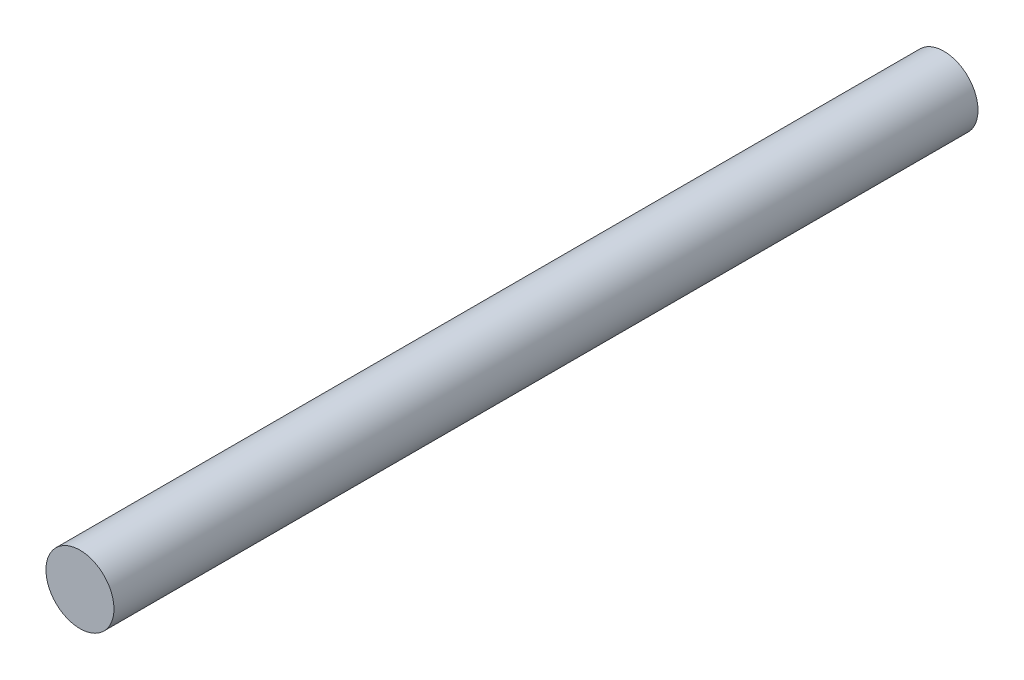
ISO-10303-21;
HEADER;
FILE_DESCRIPTION(('STEP AP214'),'2;1');
FILE_NAME('part.step','',(''),(''),'','','');
FILE_SCHEMA(('AUTOMOTIVE_DESIGN { 1 0 10303 214 1 1 1 1 }'));
ENDSEC;
DATA;
#1=APPLICATION_CONTEXT('core data for automotive mechanical design processes');
#2=APPLICATION_PROTOCOL_DEFINITION('international standard','automotive_design',2000,#1);
#3=PRODUCT_CONTEXT('',#1,'mechanical');
#4=PRODUCT('Part','Part','',(#3));
#5=PRODUCT_RELATED_PRODUCT_CATEGORY('part','',(#4));
#6=PRODUCT_DEFINITION_FORMATION('','',#4);
#7=PRODUCT_DEFINITION_CONTEXT('part definition',#1,'design');
#8=PRODUCT_DEFINITION('design','',#6,#7);
#9=PRODUCT_DEFINITION_SHAPE('','',#8);
#10=(LENGTH_UNIT() NAMED_UNIT(*) SI_UNIT(.MILLI.,.METRE.));
#11=(NAMED_UNIT(*) PLANE_ANGLE_UNIT() SI_UNIT($,.RADIAN.));
#12=(NAMED_UNIT(*) SI_UNIT($,.STERADIAN.) SOLID_ANGLE_UNIT());
#13=UNCERTAINTY_MEASURE_WITH_UNIT(LENGTH_MEASURE(1.E-05),#10,'distance_accuracy_value','');
#14=(GEOMETRIC_REPRESENTATION_CONTEXT(3) GLOBAL_UNCERTAINTY_ASSIGNED_CONTEXT((#13)) GLOBAL_UNIT_ASSIGNED_CONTEXT((#10,
#11,#12)) REPRESENTATION_CONTEXT('',''));
#15=CARTESIAN_POINT('',(0.,0.,0.));
#16=DIRECTION('',(0.,0.,1.));
#17=DIRECTION('',(1.,0.,0.));
#18=AXIS2_PLACEMENT_3D('',#15,#16,#17);
#19=CARTESIAN_POINT('',(0.,0.,-25.4));
#20=DIRECTION('',(0.,0.,1.));
#21=DIRECTION('',(1.,0.,0.));
#22=AXIS2_PLACEMENT_3D('',#19,#20,#21);
#23=CYLINDRICAL_SURFACE('',#22,4.5);
#24=CARTESIAN_POINT('',(0.,0.,-25.4));
#25=DIRECTION('',(0.,0.,1.));
#26=DIRECTION('',(1.,0.,0.));
#27=AXIS2_PLACEMENT_3D('',#24,#25,#26);
#28=CIRCLE('',#27,4.5);
#29=CARTESIAN_POINT('',(4.5,0.,-25.4));
#30=VERTEX_POINT('',#29);
#31=EDGE_CURVE('E12',#30,#30,#28,.T.);
#32=ORIENTED_EDGE('',*,*,#31,.T.);
#33=EDGE_LOOP('',(#32));
#34=FACE_BOUND('',#33,.T.);
#35=CARTESIAN_POINT('',(0.,0.,88.9));
#36=DIRECTION('',(0.,0.,1.));
#37=DIRECTION('',(1.,0.,0.));
#38=AXIS2_PLACEMENT_3D('',#35,#36,#37);
#39=CIRCLE('',#38,4.5);
#40=CARTESIAN_POINT('',(4.5,0.,88.9));
#41=VERTEX_POINT('',#40);
#42=EDGE_CURVE('E49',#41,#41,#39,.T.);
#43=ORIENTED_EDGE('',*,*,#42,.F.);
#44=EDGE_LOOP('',(#43));
#45=FACE_BOUND('',#44,.T.);
#46=ADVANCED_FACE('F46',(#34,#45),#23,.T.);
#47=CARTESIAN_POINT('',(0.,0.,-25.4));
#48=DIRECTION('',(0.,0.,1.));
#49=DIRECTION('',(1.,0.,0.));
#50=AXIS2_PLACEMENT_3D('',#47,#48,#49);
#51=PLANE('',#50);
#52=ORIENTED_EDGE('',*,*,#31,.F.);
#53=EDGE_LOOP('',(#52));
#54=FACE_BOUND('',#53,.T.);
#55=ADVANCED_FACE('F61',(#54),#51,.F.);
#56=CARTESIAN_POINT('',(0.,0.,88.9));
#57=DIRECTION('',(0.,0.,1.));
#58=DIRECTION('',(1.,0.,0.));
#59=AXIS2_PLACEMENT_3D('',#56,#57,#58);
#60=PLANE('',#59);
#61=ORIENTED_EDGE('',*,*,#42,.T.);
#62=EDGE_LOOP('',(#61));
#63=FACE_BOUND('',#62,.T.);
#64=ADVANCED_FACE('F58',(#63),#60,.T.);
#65=CLOSED_SHELL('',(#46,#55,#64));
#66=MANIFOLD_SOLID_BREP('B2',#65);
#67=ADVANCED_BREP_SHAPE_REPRESENTATION('',(#18,#66),#14);
#68=SHAPE_DEFINITION_REPRESENTATION(#9,#67);
ENDSEC;
END-ISO-10303-21;
